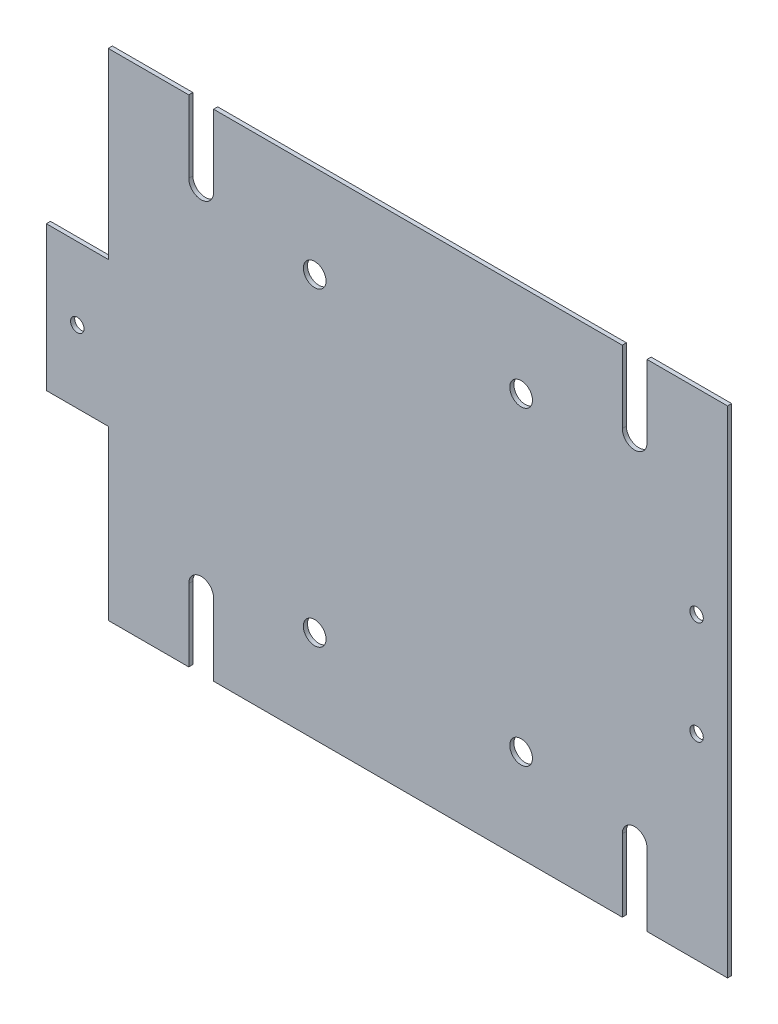
ISO-10303-21;
HEADER;
FILE_DESCRIPTION(('STEP AP214'),'2;1');
FILE_NAME('part.step','',(''),(''),'','','');
FILE_SCHEMA(('AUTOMOTIVE_DESIGN { 1 0 10303 214 1 1 1 1 }'));
ENDSEC;
DATA;
#1=APPLICATION_CONTEXT('core data for automotive mechanical design processes');
#2=APPLICATION_PROTOCOL_DEFINITION('international standard','automotive_design',2000,#1);
#3=PRODUCT_CONTEXT('',#1,'mechanical');
#4=PRODUCT('Part','Part','',(#3));
#5=PRODUCT_RELATED_PRODUCT_CATEGORY('part','',(#4));
#6=PRODUCT_DEFINITION_FORMATION('','',#4);
#7=PRODUCT_DEFINITION_CONTEXT('part definition',#1,'design');
#8=PRODUCT_DEFINITION('design','',#6,#7);
#9=PRODUCT_DEFINITION_SHAPE('','',#8);
#10=(LENGTH_UNIT() NAMED_UNIT(*) SI_UNIT(.MILLI.,.METRE.));
#11=(NAMED_UNIT(*) PLANE_ANGLE_UNIT() SI_UNIT($,.RADIAN.));
#12=(NAMED_UNIT(*) SI_UNIT($,.STERADIAN.) SOLID_ANGLE_UNIT());
#13=UNCERTAINTY_MEASURE_WITH_UNIT(LENGTH_MEASURE(1.E-05),#10,'distance_accuracy_value','');
#14=(GEOMETRIC_REPRESENTATION_CONTEXT(3) GLOBAL_UNCERTAINTY_ASSIGNED_CONTEXT((#13)) GLOBAL_UNIT_ASSIGNED_CONTEXT((#10,
#11,#12)) REPRESENTATION_CONTEXT('',''));
#15=CARTESIAN_POINT('',(0.,0.,0.));
#16=DIRECTION('',(0.,0.,1.));
#17=DIRECTION('',(1.,0.,0.));
#18=AXIS2_PLACEMENT_3D('',#15,#16,#17);
#19=CARTESIAN_POINT('',(23.9488218182788,-146.633764285917,2.));
#20=DIRECTION('',(0.,0.,1.));
#21=DIRECTION('',(1.,0.,0.));
#22=AXIS2_PLACEMENT_3D('',#19,#20,#21);
#23=PLANE('',#22);
#24=CARTESIAN_POINT('',(-131.051178181721,-136.753764285917,2.));
#25=DIRECTION('',(0.,0.,1.));
#26=DIRECTION('',(1.,0.,0.));
#27=AXIS2_PLACEMENT_3D('',#24,#25,#26);
#28=CIRCLE('',#27,5.50000000000002);
#29=CARTESIAN_POINT('',(-125.551178181721,-136.753764285917,2.));
#30=VERTEX_POINT('',#29);
#31=EDGE_CURVE('E434',#30,#30,#28,.T.);
#32=ORIENTED_EDGE('',*,*,#31,.F.);
#33=EDGE_LOOP('',(#32));
#34=FACE_BOUND('',#33,.T.);
#35=CARTESIAN_POINT('',(-246.051178181721,-65.1798561151079,2.));
#36=DIRECTION('',(0.,0.,1.));
#37=DIRECTION('',(1.,0.,0.));
#38=AXIS2_PLACEMENT_3D('',#35,#36,#37);
#39=CIRCLE('',#38,3.25000000000001);
#40=CARTESIAN_POINT('',(-242.801178181721,-65.1798561151079,2.));
#41=VERTEX_POINT('',#40);
#42=EDGE_CURVE('E422',#41,#41,#39,.T.);
#43=ORIENTED_EDGE('',*,*,#42,.F.);
#44=EDGE_LOOP('',(#43));
#45=FACE_BOUND('',#44,.T.);
#46=CARTESIAN_POINT('',(-131.051178181721,13.4862357140828,2.));
#47=DIRECTION('',(0.,0.,1.));
#48=DIRECTION('',(1.,0.,0.));
#49=AXIS2_PLACEMENT_3D('',#46,#47,#48);
#50=CIRCLE('',#49,5.50000000000002);
#51=CARTESIAN_POINT('',(-125.551178181721,13.4862357140828,2.));
#52=VERTEX_POINT('',#51);
#53=EDGE_CURVE('E410',#52,#52,#50,.T.);
#54=ORIENTED_EDGE('',*,*,#53,.F.);
#55=EDGE_LOOP('',(#54));
#56=FACE_BOUND('',#55,.T.);
#57=DIRECTION('',(0.,1.,0.));
#58=VECTOR('',#57,1.);
#59=CARTESIAN_POINT('',(68.9488218182787,58.3662357140828,2.));
#60=LINE('',#59,#58);
#61=CARTESIAN_POINT('',(68.9488218182788,-181.633764285917,2.));
#62=VERTEX_POINT('',#61);
#63=CARTESIAN_POINT('',(68.9488218182787,58.3662357140828,2.));
#64=VERTEX_POINT('',#63);
#65=EDGE_CURVE('E51',#62,#64,#60,.T.);
#66=ORIENTED_EDGE('',*,*,#65,.T.);
#67=DIRECTION('',(-1.,0.,0.));
#68=VECTOR('',#67,1.);
#69=CARTESIAN_POINT('',(68.9488218182787,58.3662357140828,2.));
#70=LINE('',#69,#68);
#71=CARTESIAN_POINT('',(29.9488218182788,58.3662357140828,2.));
#72=VERTEX_POINT('',#71);
#73=EDGE_CURVE('E143',#64,#72,#70,.T.);
#74=ORIENTED_EDGE('',*,*,#73,.T.);
#75=DIRECTION('',(0.,-1.,0.));
#76=VECTOR('',#75,1.);
#77=CARTESIAN_POINT('',(29.9488218182788,58.3662357140828,2.));
#78=LINE('',#77,#76);
#79=CARTESIAN_POINT('',(29.9488218182787,23.3662357140828,2.));
#80=VERTEX_POINT('',#79);
#81=EDGE_CURVE('E339',#72,#80,#78,.T.);
#82=ORIENTED_EDGE('',*,*,#81,.T.);
#83=CARTESIAN_POINT('',(23.9488218182787,23.3662357140828,2.));
#84=DIRECTION('',(0.,0.,-1.));
#85=DIRECTION('',(1.,0.,0.));
#86=AXIS2_PLACEMENT_3D('',#83,#84,#85);
#87=CIRCLE('',#86,6.);
#88=CARTESIAN_POINT('',(17.9488218182787,23.3662357140828,2.));
#89=VERTEX_POINT('',#88);
#90=EDGE_CURVE('E359',#80,#89,#87,.T.);
#91=ORIENTED_EDGE('',*,*,#90,.T.);
#92=DIRECTION('',(0.,1.,0.));
#93=VECTOR('',#92,1.);
#94=CARTESIAN_POINT('',(17.9488218182788,58.3662357140828,2.));
#95=LINE('',#94,#93);
#96=CARTESIAN_POINT('',(17.9488218182788,58.3662357140828,2.));
#97=VERTEX_POINT('',#96);
#98=EDGE_CURVE('E356',#89,#97,#95,.T.);
#99=ORIENTED_EDGE('',*,*,#98,.T.);
#100=DIRECTION('',(-1.,0.,0.));
#101=VECTOR('',#100,1.);
#102=CARTESIAN_POINT('',(17.9488218182788,58.3662357140828,2.));
#103=LINE('',#102,#101);
#104=CARTESIAN_POINT('',(-180.051178181721,58.3662357140828,2.));
#105=VERTEX_POINT('',#104);
#106=EDGE_CURVE('E358',#97,#105,#103,.T.);
#107=ORIENTED_EDGE('',*,*,#106,.T.);
#108=DIRECTION('',(0.,-1.,0.));
#109=VECTOR('',#108,1.);
#110=CARTESIAN_POINT('',(-180.051178181721,58.3662357140828,2.));
#111=LINE('',#110,#109);
#112=CARTESIAN_POINT('',(-180.051178181721,23.3662357140828,2.));
#113=VERTEX_POINT('',#112);
#114=EDGE_CURVE('E361',#105,#113,#111,.T.);
#115=ORIENTED_EDGE('',*,*,#114,.T.);
#116=CARTESIAN_POINT('',(-186.051178181721,23.3662357140828,2.));
#117=DIRECTION('',(0.,0.,-1.));
#118=DIRECTION('',(1.,0.,0.));
#119=AXIS2_PLACEMENT_3D('',#116,#117,#118);
#120=CIRCLE('',#119,5.99999999999996);
#121=CARTESIAN_POINT('',(-192.051178181721,23.3662357140828,2.));
#122=VERTEX_POINT('',#121);
#123=EDGE_CURVE('E367',#113,#122,#120,.T.);
#124=ORIENTED_EDGE('',*,*,#123,.T.);
#125=DIRECTION('',(0.,1.,0.));
#126=VECTOR('',#125,1.);
#127=CARTESIAN_POINT('',(-192.051178181721,58.3662357140828,2.));
#128=LINE('',#127,#126);
#129=CARTESIAN_POINT('',(-192.051178181721,58.3662357140828,2.));
#130=VERTEX_POINT('',#129);
#131=EDGE_CURVE('E369',#122,#130,#128,.T.);
#132=ORIENTED_EDGE('',*,*,#131,.T.);
#133=DIRECTION('',(-1.,0.,0.));
#134=VECTOR('',#133,1.);
#135=CARTESIAN_POINT('',(-192.051178181721,58.3662357140828,2.));
#136=LINE('',#135,#134);
#137=CARTESIAN_POINT('',(-231.051178181721,58.3662357140828,2.));
#138=VERTEX_POINT('',#137);
#139=EDGE_CURVE('E371',#130,#138,#136,.T.);
#140=ORIENTED_EDGE('',*,*,#139,.T.);
#141=DIRECTION('',(0.,-1.,0.));
#142=VECTOR('',#141,1.);
#143=CARTESIAN_POINT('',(-231.051178181721,58.3662357140828,2.));
#144=LINE('',#143,#142);
#145=CARTESIAN_POINT('',(-231.051178181721,-30.1798561151079,2.));
#146=VERTEX_POINT('',#145);
#147=EDGE_CURVE('E373',#138,#146,#144,.T.);
#148=ORIENTED_EDGE('',*,*,#147,.T.);
#149=DIRECTION('',(-1.,0.,0.));
#150=VECTOR('',#149,1.);
#151=CARTESIAN_POINT('',(-231.051178181721,-30.1798561151079,2.));
#152=LINE('',#151,#150);
#153=CARTESIAN_POINT('',(-261.051178181721,-30.1798561151079,2.));
#154=VERTEX_POINT('',#153);
#155=EDGE_CURVE('E375',#146,#154,#152,.T.);
#156=ORIENTED_EDGE('',*,*,#155,.T.);
#157=DIRECTION('',(0.,-1.,0.));
#158=VECTOR('',#157,1.);
#159=CARTESIAN_POINT('',(-261.051178181721,-30.1798561151079,2.));
#160=LINE('',#159,#158);
#161=CARTESIAN_POINT('',(-261.051178181721,-100.179856115108,2.));
#162=VERTEX_POINT('',#161);
#163=EDGE_CURVE('E377',#154,#162,#160,.T.);
#164=ORIENTED_EDGE('',*,*,#163,.T.);
#165=DIRECTION('',(1.,0.,0.));
#166=VECTOR('',#165,1.);
#167=CARTESIAN_POINT('',(-261.051178181721,-100.179856115108,2.));
#168=LINE('',#167,#166);
#169=CARTESIAN_POINT('',(-231.051178181721,-100.179856115108,2.));
#170=VERTEX_POINT('',#169);
#171=EDGE_CURVE('E379',#162,#170,#168,.T.);
#172=ORIENTED_EDGE('',*,*,#171,.T.);
#173=DIRECTION('',(0.,-1.,0.));
#174=VECTOR('',#173,1.);
#175=CARTESIAN_POINT('',(-231.051178181721,-100.179856115108,2.));
#176=LINE('',#175,#174);
#177=CARTESIAN_POINT('',(-231.051178181721,-181.633764285917,2.));
#178=VERTEX_POINT('',#177);
#179=EDGE_CURVE('E381',#170,#178,#176,.T.);
#180=ORIENTED_EDGE('',*,*,#179,.T.);
#181=DIRECTION('',(1.,0.,0.));
#182=VECTOR('',#181,1.);
#183=CARTESIAN_POINT('',(-192.051178181721,-181.633764285917,2.));
#184=LINE('',#183,#182);
#185=CARTESIAN_POINT('',(-192.051178181721,-181.633764285917,2.));
#186=VERTEX_POINT('',#185);
#187=EDGE_CURVE('E383',#178,#186,#184,.T.);
#188=ORIENTED_EDGE('',*,*,#187,.T.);
#189=DIRECTION('',(0.,1.,0.));
#190=VECTOR('',#189,1.);
#191=CARTESIAN_POINT('',(-192.051178181721,-181.633764285917,2.));
#192=LINE('',#191,#190);
#193=CARTESIAN_POINT('',(-192.051178181721,-146.633764285917,2.));
#194=VERTEX_POINT('',#193);
#195=EDGE_CURVE('E385',#186,#194,#192,.T.);
#196=ORIENTED_EDGE('',*,*,#195,.T.);
#197=CARTESIAN_POINT('',(-186.051178181721,-146.633764285917,2.));
#198=DIRECTION('',(0.,0.,-1.));
#199=DIRECTION('',(1.,0.,0.));
#200=AXIS2_PLACEMENT_3D('',#197,#198,#199);
#201=CIRCLE('',#200,6.00000000000001);
#202=CARTESIAN_POINT('',(-180.051178181721,-146.633764285917,2.));
#203=VERTEX_POINT('',#202);
#204=EDGE_CURVE('E387',#194,#203,#201,.T.);
#205=ORIENTED_EDGE('',*,*,#204,.T.);
#206=DIRECTION('',(0.,-1.,0.));
#207=VECTOR('',#206,1.);
#208=CARTESIAN_POINT('',(-180.051178181721,-181.633764285917,2.));
#209=LINE('',#208,#207);
#210=CARTESIAN_POINT('',(-180.051178181721,-181.633764285917,2.));
#211=VERTEX_POINT('',#210);
#212=EDGE_CURVE('E389',#203,#211,#209,.T.);
#213=ORIENTED_EDGE('',*,*,#212,.T.);
#214=DIRECTION('',(1.,0.,0.));
#215=VECTOR('',#214,1.);
#216=CARTESIAN_POINT('',(17.9488218182788,-181.633764285917,2.));
#217=LINE('',#216,#215);
#218=CARTESIAN_POINT('',(17.9488218182788,-181.633764285917,2.));
#219=VERTEX_POINT('',#218);
#220=EDGE_CURVE('E391',#211,#219,#217,.T.);
#221=ORIENTED_EDGE('',*,*,#220,.T.);
#222=DIRECTION('',(0.,1.,0.));
#223=VECTOR('',#222,1.);
#224=CARTESIAN_POINT('',(17.9488218182788,-146.633764285917,2.));
#225=LINE('',#224,#223);
#226=CARTESIAN_POINT('',(17.9488218182788,-146.633764285917,2.));
#227=VERTEX_POINT('',#226);
#228=EDGE_CURVE('E211',#219,#227,#225,.T.);
#229=ORIENTED_EDGE('',*,*,#228,.T.);
#230=CARTESIAN_POINT('',(23.9488218182788,-146.633764285917,2.));
#231=DIRECTION('',(0.,0.,-1.));
#232=DIRECTION('',(1.,0.,0.));
#233=AXIS2_PLACEMENT_3D('',#230,#231,#232);
#234=CIRCLE('',#233,6.00000000000001);
#235=CARTESIAN_POINT('',(29.9488218182788,-146.633764285917,2.));
#236=VERTEX_POINT('',#235);
#237=EDGE_CURVE('E205',#227,#236,#234,.T.);
#238=ORIENTED_EDGE('',*,*,#237,.T.);
#239=DIRECTION('',(0.,-1.,0.));
#240=VECTOR('',#239,1.);
#241=CARTESIAN_POINT('',(29.9488218182788,-146.633764285917,2.));
#242=LINE('',#241,#240);
#243=CARTESIAN_POINT('',(29.9488218182788,-181.633764285917,2.));
#244=VERTEX_POINT('',#243);
#245=EDGE_CURVE('E209',#236,#244,#242,.T.);
#246=ORIENTED_EDGE('',*,*,#245,.T.);
#247=DIRECTION('',(1.,0.,0.));
#248=VECTOR('',#247,1.);
#249=CARTESIAN_POINT('',(68.9488218182788,-181.633764285917,2.));
#250=LINE('',#249,#248);
#251=EDGE_CURVE('E225',#244,#62,#250,.T.);
#252=ORIENTED_EDGE('',*,*,#251,.T.);
#253=EDGE_LOOP('',(#66,#74,#82,#91,#99,#107,#115,#124,#132,#140,#148,#156,#164,#172,#180,#188,
#196,#205,#213,#221,#229,#238,#246,#252));
#254=FACE_BOUND('',#253,.T.);
#255=CARTESIAN_POINT('',(53.9488218182788,-36.6337642859172,2.));
#256=DIRECTION('',(0.,0.,1.));
#257=DIRECTION('',(1.,0.,0.));
#258=AXIS2_PLACEMENT_3D('',#255,#256,#257);
#259=CIRCLE('',#258,3.25);
#260=CARTESIAN_POINT('',(57.1988218182788,-36.6337642859172,2.));
#261=VERTEX_POINT('',#260);
#262=EDGE_CURVE('E234',#261,#261,#259,.T.);
#263=ORIENTED_EDGE('',*,*,#262,.F.);
#264=EDGE_LOOP('',(#263));
#265=FACE_BOUND('',#264,.T.);
#266=CARTESIAN_POINT('',(53.9488218182788,-86.6337642859172,2.));
#267=DIRECTION('',(0.,0.,1.));
#268=DIRECTION('',(1.,0.,0.));
#269=AXIS2_PLACEMENT_3D('',#266,#267,#268);
#270=CIRCLE('',#269,3.25);
#271=CARTESIAN_POINT('',(57.1988218182788,-86.6337642859172,2.));
#272=VERTEX_POINT('',#271);
#273=EDGE_CURVE('E416',#272,#272,#270,.T.);
#274=ORIENTED_EDGE('',*,*,#273,.F.);
#275=EDGE_LOOP('',(#274));
#276=FACE_BOUND('',#275,.T.);
#277=CARTESIAN_POINT('',(-31.0511781817212,-136.753764285917,2.));
#278=DIRECTION('',(0.,0.,1.));
#279=DIRECTION('',(1.,0.,0.));
#280=AXIS2_PLACEMENT_3D('',#277,#278,#279);
#281=CIRCLE('',#280,5.5);
#282=CARTESIAN_POINT('',(-25.5511781817212,-136.753764285917,2.));
#283=VERTEX_POINT('',#282);
#284=EDGE_CURVE('E428',#283,#283,#281,.T.);
#285=ORIENTED_EDGE('',*,*,#284,.F.);
#286=EDGE_LOOP('',(#285));
#287=FACE_BOUND('',#286,.T.);
#288=CARTESIAN_POINT('',(-31.0511781817212,13.4862357140828,2.));
#289=DIRECTION('',(0.,0.,1.));
#290=DIRECTION('',(1.,0.,0.));
#291=AXIS2_PLACEMENT_3D('',#288,#289,#290);
#292=CIRCLE('',#291,5.5);
#293=CARTESIAN_POINT('',(-25.5511781817213,13.4862357140828,2.));
#294=VERTEX_POINT('',#293);
#295=EDGE_CURVE('E440',#294,#294,#292,.T.);
#296=ORIENTED_EDGE('',*,*,#295,.F.);
#297=EDGE_LOOP('',(#296));
#298=FACE_BOUND('',#297,.T.);
#299=ADVANCED_FACE('F34',(#34,#45,#56,#254,#265,#276,#287,#298),#23,.T.);
#300=CARTESIAN_POINT('',(23.9488218182788,-146.633764285917,0.));
#301=DIRECTION('',(0.,0.,1.));
#302=DIRECTION('',(1.,0.,0.));
#303=AXIS2_PLACEMENT_3D('',#300,#301,#302);
#304=PLANE('',#303);
#305=DIRECTION('',(-1.,0.,0.));
#306=VECTOR('',#305,1.);
#307=CARTESIAN_POINT('',(68.9488218182787,58.3662357140828,0.));
#308=LINE('',#307,#306);
#309=CARTESIAN_POINT('',(68.9488218182787,58.3662357140828,0.));
#310=VERTEX_POINT('',#309);
#311=CARTESIAN_POINT('',(29.9488218182788,58.3662357140828,0.));
#312=VERTEX_POINT('',#311);
#313=EDGE_CURVE('E231',#310,#312,#308,.T.);
#314=ORIENTED_EDGE('',*,*,#313,.F.);
#315=DIRECTION('',(0.,1.,0.));
#316=VECTOR('',#315,1.);
#317=CARTESIAN_POINT('',(68.9488218182788,-26.6337642859172,0.));
#318=LINE('',#317,#316);
#319=CARTESIAN_POINT('',(68.9488218182788,-181.633764285917,0.));
#320=VERTEX_POINT('',#319);
#321=EDGE_CURVE('E275',#320,#310,#318,.T.);
#322=ORIENTED_EDGE('',*,*,#321,.F.);
#323=DIRECTION('',(1.,0.,0.));
#324=VECTOR('',#323,1.);
#325=CARTESIAN_POINT('',(68.9488218182788,-181.633764285917,0.));
#326=LINE('',#325,#324);
#327=CARTESIAN_POINT('',(29.9488218182788,-181.633764285917,0.));
#328=VERTEX_POINT('',#327);
#329=EDGE_CURVE('E136',#328,#320,#326,.T.);
#330=ORIENTED_EDGE('',*,*,#329,.F.);
#331=DIRECTION('',(0.,-1.,0.));
#332=VECTOR('',#331,1.);
#333=CARTESIAN_POINT('',(29.9488218182788,-146.633764285917,0.));
#334=LINE('',#333,#332);
#335=CARTESIAN_POINT('',(29.9488218182788,-146.633764285917,0.));
#336=VERTEX_POINT('',#335);
#337=EDGE_CURVE('E129',#336,#328,#334,.T.);
#338=ORIENTED_EDGE('',*,*,#337,.F.);
#339=CARTESIAN_POINT('',(23.9488218182788,-146.633764285917,0.));
#340=DIRECTION('',(0.,0.,-1.));
#341=DIRECTION('',(1.,0.,0.));
#342=AXIS2_PLACEMENT_3D('',#339,#340,#341);
#343=CIRCLE('',#342,6.00000000000001);
#344=CARTESIAN_POINT('',(17.9488218182788,-146.633764285917,0.));
#345=VERTEX_POINT('',#344);
#346=EDGE_CURVE('E219',#345,#336,#343,.T.);
#347=ORIENTED_EDGE('',*,*,#346,.F.);
#348=DIRECTION('',(0.,1.,0.));
#349=VECTOR('',#348,1.);
#350=CARTESIAN_POINT('',(17.9488218182788,-146.633764285917,0.));
#351=LINE('',#350,#349);
#352=CARTESIAN_POINT('',(17.9488218182788,-181.633764285917,0.));
#353=VERTEX_POINT('',#352);
#354=EDGE_CURVE('E270',#353,#345,#351,.T.);
#355=ORIENTED_EDGE('',*,*,#354,.F.);
#356=DIRECTION('',(1.,0.,0.));
#357=VECTOR('',#356,1.);
#358=CARTESIAN_POINT('',(17.9488218182788,-181.633764285917,0.));
#359=LINE('',#358,#357);
#360=CARTESIAN_POINT('',(-180.051178181721,-181.633764285917,0.));
#361=VERTEX_POINT('',#360);
#362=EDGE_CURVE('E268',#361,#353,#359,.T.);
#363=ORIENTED_EDGE('',*,*,#362,.F.);
#364=DIRECTION('',(0.,-1.,0.));
#365=VECTOR('',#364,1.);
#366=CARTESIAN_POINT('',(-180.051178181721,-181.633764285917,0.));
#367=LINE('',#366,#365);
#368=CARTESIAN_POINT('',(-180.051178181721,-146.633764285917,0.));
#369=VERTEX_POINT('',#368);
#370=EDGE_CURVE('E266',#369,#361,#367,.T.);
#371=ORIENTED_EDGE('',*,*,#370,.F.);
#372=CARTESIAN_POINT('',(-186.051178181721,-146.633764285917,0.));
#373=DIRECTION('',(0.,0.,-1.));
#374=DIRECTION('',(1.,0.,0.));
#375=AXIS2_PLACEMENT_3D('',#372,#373,#374);
#376=CIRCLE('',#375,6.00000000000001);
#377=CARTESIAN_POINT('',(-192.051178181721,-146.633764285917,0.));
#378=VERTEX_POINT('',#377);
#379=EDGE_CURVE('E264',#378,#369,#376,.T.);
#380=ORIENTED_EDGE('',*,*,#379,.F.);
#381=DIRECTION('',(0.,1.,0.));
#382=VECTOR('',#381,1.);
#383=CARTESIAN_POINT('',(-192.051178181721,-181.633764285917,0.));
#384=LINE('',#383,#382);
#385=CARTESIAN_POINT('',(-192.051178181721,-181.633764285917,0.));
#386=VERTEX_POINT('',#385);
#387=EDGE_CURVE('E262',#386,#378,#384,.T.);
#388=ORIENTED_EDGE('',*,*,#387,.F.);
#389=DIRECTION('',(1.,0.,0.));
#390=VECTOR('',#389,1.);
#391=CARTESIAN_POINT('',(-192.051178181721,-181.633764285917,0.));
#392=LINE('',#391,#390);
#393=CARTESIAN_POINT('',(-231.051178181721,-181.633764285917,0.));
#394=VERTEX_POINT('',#393);
#395=EDGE_CURVE('E260',#394,#386,#392,.T.);
#396=ORIENTED_EDGE('',*,*,#395,.F.);
#397=DIRECTION('',(0.,-1.,0.));
#398=VECTOR('',#397,1.);
#399=CARTESIAN_POINT('',(-231.051178181721,-100.179856115108,0.));
#400=LINE('',#399,#398);
#401=CARTESIAN_POINT('',(-231.051178181721,-100.179856115108,0.));
#402=VERTEX_POINT('',#401);
#403=EDGE_CURVE('E258',#402,#394,#400,.T.);
#404=ORIENTED_EDGE('',*,*,#403,.F.);
#405=DIRECTION('',(1.,0.,0.));
#406=VECTOR('',#405,1.);
#407=CARTESIAN_POINT('',(-261.051178181721,-100.179856115108,0.));
#408=LINE('',#407,#406);
#409=CARTESIAN_POINT('',(-261.051178181721,-100.179856115108,0.));
#410=VERTEX_POINT('',#409);
#411=EDGE_CURVE('E256',#410,#402,#408,.T.);
#412=ORIENTED_EDGE('',*,*,#411,.F.);
#413=DIRECTION('',(0.,-1.,0.));
#414=VECTOR('',#413,1.);
#415=CARTESIAN_POINT('',(-261.051178181721,-30.1798561151079,0.));
#416=LINE('',#415,#414);
#417=CARTESIAN_POINT('',(-261.051178181721,-30.1798561151079,0.));
#418=VERTEX_POINT('',#417);
#419=EDGE_CURVE('E254',#418,#410,#416,.T.);
#420=ORIENTED_EDGE('',*,*,#419,.F.);
#421=DIRECTION('',(-1.,0.,0.));
#422=VECTOR('',#421,1.);
#423=CARTESIAN_POINT('',(-231.051178181721,-30.1798561151079,0.));
#424=LINE('',#423,#422);
#425=CARTESIAN_POINT('',(-231.051178181721,-30.1798561151079,0.));
#426=VERTEX_POINT('',#425);
#427=EDGE_CURVE('E252',#426,#418,#424,.T.);
#428=ORIENTED_EDGE('',*,*,#427,.F.);
#429=DIRECTION('',(0.,-1.,0.));
#430=VECTOR('',#429,1.);
#431=CARTESIAN_POINT('',(-231.051178181721,58.3662357140828,0.));
#432=LINE('',#431,#430);
#433=CARTESIAN_POINT('',(-231.051178181721,58.3662357140828,0.));
#434=VERTEX_POINT('',#433);
#435=EDGE_CURVE('E250',#434,#426,#432,.T.);
#436=ORIENTED_EDGE('',*,*,#435,.F.);
#437=DIRECTION('',(-1.,0.,0.));
#438=VECTOR('',#437,1.);
#439=CARTESIAN_POINT('',(-192.051178181721,58.3662357140828,0.));
#440=LINE('',#439,#438);
#441=CARTESIAN_POINT('',(-192.051178181721,58.3662357140828,0.));
#442=VERTEX_POINT('',#441);
#443=EDGE_CURVE('E248',#442,#434,#440,.T.);
#444=ORIENTED_EDGE('',*,*,#443,.F.);
#445=DIRECTION('',(0.,1.,0.));
#446=VECTOR('',#445,1.);
#447=CARTESIAN_POINT('',(-192.051178181721,58.3662357140828,0.));
#448=LINE('',#447,#446);
#449=CARTESIAN_POINT('',(-192.051178181721,23.3662357140828,0.));
#450=VERTEX_POINT('',#449);
#451=EDGE_CURVE('E246',#450,#442,#448,.T.);
#452=ORIENTED_EDGE('',*,*,#451,.F.);
#453=CARTESIAN_POINT('',(-186.051178181721,23.3662357140828,0.));
#454=DIRECTION('',(0.,0.,-1.));
#455=DIRECTION('',(1.,0.,0.));
#456=AXIS2_PLACEMENT_3D('',#453,#454,#455);
#457=CIRCLE('',#456,5.99999999999996);
#458=CARTESIAN_POINT('',(-180.051178181721,23.3662357140828,0.));
#459=VERTEX_POINT('',#458);
#460=EDGE_CURVE('E244',#459,#450,#457,.T.);
#461=ORIENTED_EDGE('',*,*,#460,.F.);
#462=DIRECTION('',(0.,-1.,0.));
#463=VECTOR('',#462,1.);
#464=CARTESIAN_POINT('',(-180.051178181721,58.3662357140828,0.));
#465=LINE('',#464,#463);
#466=CARTESIAN_POINT('',(-180.051178181721,58.3662357140828,0.));
#467=VERTEX_POINT('',#466);
#468=EDGE_CURVE('E242',#467,#459,#465,.T.);
#469=ORIENTED_EDGE('',*,*,#468,.F.);
#470=DIRECTION('',(-1.,0.,0.));
#471=VECTOR('',#470,1.);
#472=CARTESIAN_POINT('',(17.9488218182788,58.3662357140828,0.));
#473=LINE('',#472,#471);
#474=CARTESIAN_POINT('',(17.9488218182788,58.3662357140828,0.));
#475=VERTEX_POINT('',#474);
#476=EDGE_CURVE('E240',#475,#467,#473,.T.);
#477=ORIENTED_EDGE('',*,*,#476,.F.);
#478=DIRECTION('',(0.,1.,0.));
#479=VECTOR('',#478,1.);
#480=CARTESIAN_POINT('',(17.9488218182788,58.3662357140828,0.));
#481=LINE('',#480,#479);
#482=CARTESIAN_POINT('',(17.9488218182787,23.3662357140828,0.));
#483=VERTEX_POINT('',#482);
#484=EDGE_CURVE('E238',#483,#475,#481,.T.);
#485=ORIENTED_EDGE('',*,*,#484,.F.);
#486=CARTESIAN_POINT('',(23.9488218182787,23.3662357140828,0.));
#487=DIRECTION('',(0.,0.,-1.));
#488=DIRECTION('',(1.,0.,0.));
#489=AXIS2_PLACEMENT_3D('',#486,#487,#488);
#490=CIRCLE('',#489,6.);
#491=CARTESIAN_POINT('',(29.9488218182787,23.3662357140828,0.));
#492=VERTEX_POINT('',#491);
#493=EDGE_CURVE('E236',#492,#483,#490,.T.);
#494=ORIENTED_EDGE('',*,*,#493,.F.);
#495=DIRECTION('',(0.,-1.,0.));
#496=VECTOR('',#495,1.);
#497=CARTESIAN_POINT('',(29.9488218182788,58.3662357140828,0.));
#498=LINE('',#497,#496);
#499=EDGE_CURVE('E233',#312,#492,#498,.T.);
#500=ORIENTED_EDGE('',*,*,#499,.F.);
#501=EDGE_LOOP('',(#314,#322,#330,#338,#347,#355,#363,#371,#380,#388,#396,#404,#412,#420,#428,
#436,#444,#452,#461,#469,#477,#485,#494,#500));
#502=FACE_BOUND('',#501,.T.);
#503=CARTESIAN_POINT('',(53.9488218182788,-36.6337642859172,0.));
#504=DIRECTION('',(0.,0.,1.));
#505=DIRECTION('',(1.,0.,0.));
#506=AXIS2_PLACEMENT_3D('',#503,#504,#505);
#507=CIRCLE('',#506,3.25);
#508=CARTESIAN_POINT('',(57.1988218182788,-36.6337642859172,0.));
#509=VERTEX_POINT('',#508);
#510=EDGE_CURVE('E407',#509,#509,#507,.T.);
#511=ORIENTED_EDGE('',*,*,#510,.T.);
#512=EDGE_LOOP('',(#511));
#513=FACE_BOUND('',#512,.T.);
#514=CARTESIAN_POINT('',(-131.051178181721,13.4862357140828,0.));
#515=DIRECTION('',(0.,0.,1.));
#516=DIRECTION('',(1.,0.,0.));
#517=AXIS2_PLACEMENT_3D('',#514,#515,#516);
#518=CIRCLE('',#517,5.50000000000002);
#519=CARTESIAN_POINT('',(-125.551178181721,13.4862357140828,0.));
#520=VERTEX_POINT('',#519);
#521=EDGE_CURVE('E413',#520,#520,#518,.T.);
#522=ORIENTED_EDGE('',*,*,#521,.T.);
#523=EDGE_LOOP('',(#522));
#524=FACE_BOUND('',#523,.T.);
#525=CARTESIAN_POINT('',(53.9488218182788,-86.6337642859172,0.));
#526=DIRECTION('',(0.,0.,1.));
#527=DIRECTION('',(1.,0.,0.));
#528=AXIS2_PLACEMENT_3D('',#525,#526,#527);
#529=CIRCLE('',#528,3.25);
#530=CARTESIAN_POINT('',(57.1988218182788,-86.6337642859172,0.));
#531=VERTEX_POINT('',#530);
#532=EDGE_CURVE('E419',#531,#531,#529,.T.);
#533=ORIENTED_EDGE('',*,*,#532,.T.);
#534=EDGE_LOOP('',(#533));
#535=FACE_BOUND('',#534,.T.);
#536=CARTESIAN_POINT('',(-246.051178181721,-65.1798561151079,0.));
#537=DIRECTION('',(0.,0.,1.));
#538=DIRECTION('',(1.,0.,0.));
#539=AXIS2_PLACEMENT_3D('',#536,#537,#538);
#540=CIRCLE('',#539,3.25000000000001);
#541=CARTESIAN_POINT('',(-242.801178181721,-65.1798561151079,0.));
#542=VERTEX_POINT('',#541);
#543=EDGE_CURVE('E425',#542,#542,#540,.T.);
#544=ORIENTED_EDGE('',*,*,#543,.T.);
#545=EDGE_LOOP('',(#544));
#546=FACE_BOUND('',#545,.T.);
#547=CARTESIAN_POINT('',(-31.0511781817212,-136.753764285917,0.));
#548=DIRECTION('',(0.,0.,1.));
#549=DIRECTION('',(1.,0.,0.));
#550=AXIS2_PLACEMENT_3D('',#547,#548,#549);
#551=CIRCLE('',#550,5.5);
#552=CARTESIAN_POINT('',(-25.5511781817212,-136.753764285917,0.));
#553=VERTEX_POINT('',#552);
#554=EDGE_CURVE('E431',#553,#553,#551,.T.);
#555=ORIENTED_EDGE('',*,*,#554,.T.);
#556=EDGE_LOOP('',(#555));
#557=FACE_BOUND('',#556,.T.);
#558=CARTESIAN_POINT('',(-131.051178181721,-136.753764285917,0.));
#559=DIRECTION('',(0.,0.,1.));
#560=DIRECTION('',(1.,0.,0.));
#561=AXIS2_PLACEMENT_3D('',#558,#559,#560);
#562=CIRCLE('',#561,5.50000000000002);
#563=CARTESIAN_POINT('',(-125.551178181721,-136.753764285917,0.));
#564=VERTEX_POINT('',#563);
#565=EDGE_CURVE('E437',#564,#564,#562,.T.);
#566=ORIENTED_EDGE('',*,*,#565,.T.);
#567=EDGE_LOOP('',(#566));
#568=FACE_BOUND('',#567,.T.);
#569=CARTESIAN_POINT('',(-31.0511781817212,13.4862357140828,0.));
#570=DIRECTION('',(0.,0.,1.));
#571=DIRECTION('',(1.,0.,0.));
#572=AXIS2_PLACEMENT_3D('',#569,#570,#571);
#573=CIRCLE('',#572,5.5);
#574=CARTESIAN_POINT('',(-25.5511781817213,13.4862357140828,0.));
#575=VERTEX_POINT('',#574);
#576=EDGE_CURVE('E443',#575,#575,#573,.T.);
#577=ORIENTED_EDGE('',*,*,#576,.T.);
#578=EDGE_LOOP('',(#577));
#579=FACE_BOUND('',#578,.T.);
#580=ADVANCED_FACE('F343',(#502,#513,#524,#535,#546,#557,#568,#579),#304,.F.);
#581=CARTESIAN_POINT('',(68.9488218182787,58.3662357140828,2.));
#582=DIRECTION('',(0.,-1.,0.));
#583=DIRECTION('',(1.,0.,0.));
#584=AXIS2_PLACEMENT_3D('',#581,#582,#583);
#585=PLANE('',#584);
#586=ORIENTED_EDGE('',*,*,#313,.T.);
#587=DIRECTION('',(0.,0.,-1.));
#588=VECTOR('',#587,1.);
#589=CARTESIAN_POINT('',(29.9488218182788,58.3662357140828,2.));
#590=LINE('',#589,#588);
#591=EDGE_CURVE('E43',#72,#312,#590,.T.);
#592=ORIENTED_EDGE('',*,*,#591,.F.);
#593=ORIENTED_EDGE('',*,*,#73,.F.);
#594=DIRECTION('',(0.,0.,-1.));
#595=VECTOR('',#594,1.);
#596=CARTESIAN_POINT('',(68.9488218182787,58.3662357140828,2.));
#597=LINE('',#596,#595);
#598=EDGE_CURVE('E11',#64,#310,#597,.T.);
#599=ORIENTED_EDGE('',*,*,#598,.T.);
#600=EDGE_LOOP('',(#586,#592,#593,#599));
#601=FACE_BOUND('',#600,.T.);
#602=ADVANCED_FACE('F36',(#601),#585,.F.);
#603=CARTESIAN_POINT('',(29.9488218182788,58.3662357140828,2.));
#604=DIRECTION('',(1.,0.,0.));
#605=DIRECTION('',(0.,1.,0.));
#606=AXIS2_PLACEMENT_3D('',#603,#604,#605);
#607=PLANE('',#606);
#608=ORIENTED_EDGE('',*,*,#499,.T.);
#609=DIRECTION('',(0.,0.,-1.));
#610=VECTOR('',#609,1.);
#611=CARTESIAN_POINT('',(29.9488218182787,23.3662357140828,2.));
#612=LINE('',#611,#610);
#613=EDGE_CURVE('E331',#80,#492,#612,.T.);
#614=ORIENTED_EDGE('',*,*,#613,.F.);
#615=ORIENTED_EDGE('',*,*,#81,.F.);
#616=ORIENTED_EDGE('',*,*,#591,.T.);
#617=EDGE_LOOP('',(#608,#614,#615,#616));
#618=FACE_BOUND('',#617,.T.);
#619=ADVANCED_FACE('F337',(#618),#607,.F.);
#620=CARTESIAN_POINT('',(23.9488218182787,23.3662357140828,2.));
#621=DIRECTION('',(0.,0.,-1.));
#622=DIRECTION('',(-1.,0.,0.));
#623=AXIS2_PLACEMENT_3D('',#620,#621,#622);
#624=CYLINDRICAL_SURFACE('',#623,6.);
#625=ORIENTED_EDGE('',*,*,#493,.T.);
#626=DIRECTION('',(0.,0.,-1.));
#627=VECTOR('',#626,1.);
#628=CARTESIAN_POINT('',(17.9488218182787,23.3662357140828,2.));
#629=LINE('',#628,#627);
#630=EDGE_CURVE('E328',#89,#483,#629,.T.);
#631=ORIENTED_EDGE('',*,*,#630,.F.);
#632=ORIENTED_EDGE('',*,*,#90,.F.);
#633=ORIENTED_EDGE('',*,*,#613,.T.);
#634=EDGE_LOOP('',(#625,#631,#632,#633));
#635=FACE_BOUND('',#634,.T.);
#636=ADVANCED_FACE('F350',(#635),#624,.F.);
#637=CARTESIAN_POINT('',(17.9488218182788,58.3662357140828,2.));
#638=DIRECTION('',(-1.,0.,0.));
#639=DIRECTION('',(0.,-1.,0.));
#640=AXIS2_PLACEMENT_3D('',#637,#638,#639);
#641=PLANE('',#640);
#642=ORIENTED_EDGE('',*,*,#484,.T.);
#643=DIRECTION('',(0.,0.,-1.));
#644=VECTOR('',#643,1.);
#645=CARTESIAN_POINT('',(17.9488218182788,58.3662357140828,2.));
#646=LINE('',#645,#644);
#647=EDGE_CURVE('E325',#97,#475,#646,.T.);
#648=ORIENTED_EDGE('',*,*,#647,.F.);
#649=ORIENTED_EDGE('',*,*,#98,.F.);
#650=ORIENTED_EDGE('',*,*,#630,.T.);
#651=EDGE_LOOP('',(#642,#648,#649,#650));
#652=FACE_BOUND('',#651,.T.);
#653=ADVANCED_FACE('F354',(#652),#641,.F.);
#654=CARTESIAN_POINT('',(17.9488218182788,58.3662357140828,2.));
#655=DIRECTION('',(0.,-1.,0.));
#656=DIRECTION('',(1.,0.,0.));
#657=AXIS2_PLACEMENT_3D('',#654,#655,#656);
#658=PLANE('',#657);
#659=ORIENTED_EDGE('',*,*,#476,.T.);
#660=DIRECTION('',(0.,0.,-1.));
#661=VECTOR('',#660,1.);
#662=CARTESIAN_POINT('',(-180.051178181721,58.3662357140828,2.));
#663=LINE('',#662,#661);
#664=EDGE_CURVE('E322',#105,#467,#663,.T.);
#665=ORIENTED_EDGE('',*,*,#664,.F.);
#666=ORIENTED_EDGE('',*,*,#106,.F.);
#667=ORIENTED_EDGE('',*,*,#647,.T.);
#668=EDGE_LOOP('',(#659,#665,#666,#667));
#669=FACE_BOUND('',#668,.T.);
#670=ADVANCED_FACE('F528',(#669),#658,.F.);
#671=CARTESIAN_POINT('',(-180.051178181721,58.3662357140828,2.));
#672=DIRECTION('',(1.,0.,0.));
#673=DIRECTION('',(0.,0.,-1.));
#674=AXIS2_PLACEMENT_3D('',#671,#672,#673);
#675=PLANE('',#674);
#676=ORIENTED_EDGE('',*,*,#468,.T.);
#677=DIRECTION('',(0.,0.,-1.));
#678=VECTOR('',#677,1.);
#679=CARTESIAN_POINT('',(-180.051178181721,23.3662357140828,2.));
#680=LINE('',#679,#678);
#681=EDGE_CURVE('E319',#113,#459,#680,.T.);
#682=ORIENTED_EDGE('',*,*,#681,.F.);
#683=ORIENTED_EDGE('',*,*,#114,.F.);
#684=ORIENTED_EDGE('',*,*,#664,.T.);
#685=EDGE_LOOP('',(#676,#682,#683,#684));
#686=FACE_BOUND('',#685,.T.);
#687=ADVANCED_FACE('F524',(#686),#675,.F.);
#688=CARTESIAN_POINT('',(-186.051178181721,23.3662357140828,2.));
#689=DIRECTION('',(0.,0.,-1.));
#690=DIRECTION('',(-1.,0.,0.));
#691=AXIS2_PLACEMENT_3D('',#688,#689,#690);
#692=CYLINDRICAL_SURFACE('',#691,5.99999999999996);
#693=ORIENTED_EDGE('',*,*,#460,.T.);
#694=DIRECTION('',(0.,0.,-1.));
#695=VECTOR('',#694,1.);
#696=CARTESIAN_POINT('',(-192.051178181721,23.3662357140828,2.));
#697=LINE('',#696,#695);
#698=EDGE_CURVE('E316',#122,#450,#697,.T.);
#699=ORIENTED_EDGE('',*,*,#698,.F.);
#700=ORIENTED_EDGE('',*,*,#123,.F.);
#701=ORIENTED_EDGE('',*,*,#681,.T.);
#702=EDGE_LOOP('',(#693,#699,#700,#701));
#703=FACE_BOUND('',#702,.T.);
#704=ADVANCED_FACE('F520',(#703),#692,.F.);
#705=CARTESIAN_POINT('',(-192.051178181721,58.3662357140828,2.));
#706=DIRECTION('',(-1.,0.,0.));
#707=DIRECTION('',(0.,-1.,0.));
#708=AXIS2_PLACEMENT_3D('',#705,#706,#707);
#709=PLANE('',#708);
#710=ORIENTED_EDGE('',*,*,#451,.T.);
#711=DIRECTION('',(0.,0.,-1.));
#712=VECTOR('',#711,1.);
#713=CARTESIAN_POINT('',(-192.051178181721,58.3662357140828,2.));
#714=LINE('',#713,#712);
#715=EDGE_CURVE('E313',#130,#442,#714,.T.);
#716=ORIENTED_EDGE('',*,*,#715,.F.);
#717=ORIENTED_EDGE('',*,*,#131,.F.);
#718=ORIENTED_EDGE('',*,*,#698,.T.);
#719=EDGE_LOOP('',(#710,#716,#717,#718));
#720=FACE_BOUND('',#719,.T.);
#721=ADVANCED_FACE('F516',(#720),#709,.F.);
#722=CARTESIAN_POINT('',(-192.051178181721,58.3662357140828,2.));
#723=DIRECTION('',(0.,-1.,0.));
#724=DIRECTION('',(0.,0.,-1.));
#725=AXIS2_PLACEMENT_3D('',#722,#723,#724);
#726=PLANE('',#725);
#727=ORIENTED_EDGE('',*,*,#443,.T.);
#728=DIRECTION('',(0.,0.,-1.));
#729=VECTOR('',#728,1.);
#730=CARTESIAN_POINT('',(-231.051178181721,58.3662357140828,2.));
#731=LINE('',#730,#729);
#732=EDGE_CURVE('E310',#138,#434,#731,.T.);
#733=ORIENTED_EDGE('',*,*,#732,.F.);
#734=ORIENTED_EDGE('',*,*,#139,.F.);
#735=ORIENTED_EDGE('',*,*,#715,.T.);
#736=EDGE_LOOP('',(#727,#733,#734,#735));
#737=FACE_BOUND('',#736,.T.);
#738=ADVANCED_FACE('F512',(#737),#726,.F.);
#739=CARTESIAN_POINT('',(-231.051178181721,58.3662357140828,2.));
#740=DIRECTION('',(1.,0.,0.));
#741=DIRECTION('',(0.,1.,0.));
#742=AXIS2_PLACEMENT_3D('',#739,#740,#741);
#743=PLANE('',#742);
#744=ORIENTED_EDGE('',*,*,#435,.T.);
#745=DIRECTION('',(0.,0.,-1.));
#746=VECTOR('',#745,1.);
#747=CARTESIAN_POINT('',(-231.051178181721,-30.1798561151079,2.));
#748=LINE('',#747,#746);
#749=EDGE_CURVE('E307',#146,#426,#748,.T.);
#750=ORIENTED_EDGE('',*,*,#749,.F.);
#751=ORIENTED_EDGE('',*,*,#147,.F.);
#752=ORIENTED_EDGE('',*,*,#732,.T.);
#753=EDGE_LOOP('',(#744,#750,#751,#752));
#754=FACE_BOUND('',#753,.T.);
#755=ADVANCED_FACE('F508',(#754),#743,.F.);
#756=CARTESIAN_POINT('',(-231.051178181721,-30.1798561151079,2.));
#757=DIRECTION('',(0.,-1.,0.));
#758=DIRECTION('',(1.,0.,0.));
#759=AXIS2_PLACEMENT_3D('',#756,#757,#758);
#760=PLANE('',#759);
#761=ORIENTED_EDGE('',*,*,#427,.T.);
#762=DIRECTION('',(0.,0.,-1.));
#763=VECTOR('',#762,1.);
#764=CARTESIAN_POINT('',(-261.051178181721,-30.1798561151079,2.));
#765=LINE('',#764,#763);
#766=EDGE_CURVE('E304',#154,#418,#765,.T.);
#767=ORIENTED_EDGE('',*,*,#766,.F.);
#768=ORIENTED_EDGE('',*,*,#155,.F.);
#769=ORIENTED_EDGE('',*,*,#749,.T.);
#770=EDGE_LOOP('',(#761,#767,#768,#769));
#771=FACE_BOUND('',#770,.T.);
#772=ADVANCED_FACE('F504',(#771),#760,.F.);
#773=CARTESIAN_POINT('',(-261.051178181721,-30.1798561151079,2.));
#774=DIRECTION('',(1.,0.,0.));
#775=DIRECTION('',(0.,0.,-1.));
#776=AXIS2_PLACEMENT_3D('',#773,#774,#775);
#777=PLANE('',#776);
#778=ORIENTED_EDGE('',*,*,#419,.T.);
#779=DIRECTION('',(0.,0.,-1.));
#780=VECTOR('',#779,1.);
#781=CARTESIAN_POINT('',(-261.051178181721,-100.179856115108,2.));
#782=LINE('',#781,#780);
#783=EDGE_CURVE('E301',#162,#410,#782,.T.);
#784=ORIENTED_EDGE('',*,*,#783,.F.);
#785=ORIENTED_EDGE('',*,*,#163,.F.);
#786=ORIENTED_EDGE('',*,*,#766,.T.);
#787=EDGE_LOOP('',(#778,#784,#785,#786));
#788=FACE_BOUND('',#787,.T.);
#789=ADVANCED_FACE('F500',(#788),#777,.F.);
#790=CARTESIAN_POINT('',(-261.051178181721,-100.179856115108,2.));
#791=DIRECTION('',(0.,1.,0.));
#792=DIRECTION('',(0.,0.,1.));
#793=AXIS2_PLACEMENT_3D('',#790,#791,#792);
#794=PLANE('',#793);
#795=ORIENTED_EDGE('',*,*,#411,.T.);
#796=DIRECTION('',(0.,0.,-1.));
#797=VECTOR('',#796,1.);
#798=CARTESIAN_POINT('',(-231.051178181721,-100.179856115108,2.));
#799=LINE('',#798,#797);
#800=EDGE_CURVE('E298',#170,#402,#799,.T.);
#801=ORIENTED_EDGE('',*,*,#800,.F.);
#802=ORIENTED_EDGE('',*,*,#171,.F.);
#803=ORIENTED_EDGE('',*,*,#783,.T.);
#804=EDGE_LOOP('',(#795,#801,#802,#803));
#805=FACE_BOUND('',#804,.T.);
#806=ADVANCED_FACE('F496',(#805),#794,.F.);
#807=CARTESIAN_POINT('',(-231.051178181721,-100.179856115108,2.));
#808=DIRECTION('',(1.,0.,0.));
#809=DIRECTION('',(0.,1.,0.));
#810=AXIS2_PLACEMENT_3D('',#807,#808,#809);
#811=PLANE('',#810);
#812=ORIENTED_EDGE('',*,*,#403,.T.);
#813=DIRECTION('',(0.,0.,-1.));
#814=VECTOR('',#813,1.);
#815=CARTESIAN_POINT('',(-231.051178181721,-181.633764285917,2.));
#816=LINE('',#815,#814);
#817=EDGE_CURVE('E295',#178,#394,#816,.T.);
#818=ORIENTED_EDGE('',*,*,#817,.F.);
#819=ORIENTED_EDGE('',*,*,#179,.F.);
#820=ORIENTED_EDGE('',*,*,#800,.T.);
#821=EDGE_LOOP('',(#812,#818,#819,#820));
#822=FACE_BOUND('',#821,.T.);
#823=ADVANCED_FACE('F492',(#822),#811,.F.);
#824=CARTESIAN_POINT('',(-192.051178181721,-181.633764285917,2.));
#825=DIRECTION('',(0.,1.,0.));
#826=DIRECTION('',(0.,0.,1.));
#827=AXIS2_PLACEMENT_3D('',#824,#825,#826);
#828=PLANE('',#827);
#829=ORIENTED_EDGE('',*,*,#395,.T.);
#830=DIRECTION('',(0.,0.,-1.));
#831=VECTOR('',#830,1.);
#832=CARTESIAN_POINT('',(-192.051178181721,-181.633764285917,2.));
#833=LINE('',#832,#831);
#834=EDGE_CURVE('E292',#186,#386,#833,.T.);
#835=ORIENTED_EDGE('',*,*,#834,.F.);
#836=ORIENTED_EDGE('',*,*,#187,.F.);
#837=ORIENTED_EDGE('',*,*,#817,.T.);
#838=EDGE_LOOP('',(#829,#835,#836,#837));
#839=FACE_BOUND('',#838,.T.);
#840=ADVANCED_FACE('F488',(#839),#828,.F.);
#841=CARTESIAN_POINT('',(-192.051178181721,-181.633764285917,2.));
#842=DIRECTION('',(-1.,0.,0.));
#843=DIRECTION('',(0.,0.,1.));
#844=AXIS2_PLACEMENT_3D('',#841,#842,#843);
#845=PLANE('',#844);
#846=ORIENTED_EDGE('',*,*,#387,.T.);
#847=DIRECTION('',(0.,0.,-1.));
#848=VECTOR('',#847,1.);
#849=CARTESIAN_POINT('',(-192.051178181721,-146.633764285917,2.));
#850=LINE('',#849,#848);
#851=EDGE_CURVE('E289',#194,#378,#850,.T.);
#852=ORIENTED_EDGE('',*,*,#851,.F.);
#853=ORIENTED_EDGE('',*,*,#195,.F.);
#854=ORIENTED_EDGE('',*,*,#834,.T.);
#855=EDGE_LOOP('',(#846,#852,#853,#854));
#856=FACE_BOUND('',#855,.T.);
#857=ADVANCED_FACE('F484',(#856),#845,.F.);
#858=CARTESIAN_POINT('',(-186.051178181721,-146.633764285917,2.));
#859=DIRECTION('',(0.,0.,-1.));
#860=DIRECTION('',(-1.,0.,0.));
#861=AXIS2_PLACEMENT_3D('',#858,#859,#860);
#862=CYLINDRICAL_SURFACE('',#861,6.00000000000001);
#863=ORIENTED_EDGE('',*,*,#379,.T.);
#864=DIRECTION('',(0.,0.,-1.));
#865=VECTOR('',#864,1.);
#866=CARTESIAN_POINT('',(-180.051178181721,-146.633764285917,2.));
#867=LINE('',#866,#865);
#868=EDGE_CURVE('E286',#203,#369,#867,.T.);
#869=ORIENTED_EDGE('',*,*,#868,.F.);
#870=ORIENTED_EDGE('',*,*,#204,.F.);
#871=ORIENTED_EDGE('',*,*,#851,.T.);
#872=EDGE_LOOP('',(#863,#869,#870,#871));
#873=FACE_BOUND('',#872,.T.);
#874=ADVANCED_FACE('F480',(#873),#862,.F.);
#875=CARTESIAN_POINT('',(-180.051178181721,-181.633764285917,2.));
#876=DIRECTION('',(1.,0.,0.));
#877=DIRECTION('',(0.,0.,-1.));
#878=AXIS2_PLACEMENT_3D('',#875,#876,#877);
#879=PLANE('',#878);
#880=ORIENTED_EDGE('',*,*,#370,.T.);
#881=DIRECTION('',(0.,0.,-1.));
#882=VECTOR('',#881,1.);
#883=CARTESIAN_POINT('',(-180.051178181721,-181.633764285917,2.));
#884=LINE('',#883,#882);
#885=EDGE_CURVE('E283',#211,#361,#884,.T.);
#886=ORIENTED_EDGE('',*,*,#885,.F.);
#887=ORIENTED_EDGE('',*,*,#212,.F.);
#888=ORIENTED_EDGE('',*,*,#868,.T.);
#889=EDGE_LOOP('',(#880,#886,#887,#888));
#890=FACE_BOUND('',#889,.T.);
#891=ADVANCED_FACE('F477',(#890),#879,.F.);
#892=CARTESIAN_POINT('',(17.9488218182788,-181.633764285917,2.));
#893=DIRECTION('',(0.,1.,0.));
#894=DIRECTION('',(-1.,0.,0.));
#895=AXIS2_PLACEMENT_3D('',#892,#893,#894);
#896=PLANE('',#895);
#897=ORIENTED_EDGE('',*,*,#362,.T.);
#898=DIRECTION('',(0.,0.,-1.));
#899=VECTOR('',#898,1.);
#900=CARTESIAN_POINT('',(17.9488218182788,-181.633764285917,2.));
#901=LINE('',#900,#899);
#902=EDGE_CURVE('E280',#219,#353,#901,.T.);
#903=ORIENTED_EDGE('',*,*,#902,.F.);
#904=ORIENTED_EDGE('',*,*,#220,.F.);
#905=ORIENTED_EDGE('',*,*,#885,.T.);
#906=EDGE_LOOP('',(#897,#903,#904,#905));
#907=FACE_BOUND('',#906,.T.);
#908=ADVANCED_FACE('F397',(#907),#896,.F.);
#909=CARTESIAN_POINT('',(17.9488218182788,-146.633764285917,2.));
#910=DIRECTION('',(-1.,0.,0.));
#911=DIRECTION('',(0.,-1.,0.));
#912=AXIS2_PLACEMENT_3D('',#909,#910,#911);
#913=PLANE('',#912);
#914=ORIENTED_EDGE('',*,*,#354,.T.);
#915=DIRECTION('',(0.,0.,-1.));
#916=VECTOR('',#915,1.);
#917=CARTESIAN_POINT('',(17.9488218182788,-146.633764285917,2.));
#918=LINE('',#917,#916);
#919=EDGE_CURVE('E220',#227,#345,#918,.T.);
#920=ORIENTED_EDGE('',*,*,#919,.F.);
#921=ORIENTED_EDGE('',*,*,#228,.F.);
#922=ORIENTED_EDGE('',*,*,#902,.T.);
#923=EDGE_LOOP('',(#914,#920,#921,#922));
#924=FACE_BOUND('',#923,.T.);
#925=ADVANCED_FACE('F401',(#924),#913,.F.);
#926=CARTESIAN_POINT('',(23.9488218182788,-146.633764285917,2.));
#927=DIRECTION('',(0.,0.,-1.));
#928=DIRECTION('',(-1.,0.,0.));
#929=AXIS2_PLACEMENT_3D('',#926,#927,#928);
#930=CYLINDRICAL_SURFACE('',#929,6.00000000000001);
#931=ORIENTED_EDGE('',*,*,#346,.T.);
#932=DIRECTION('',(0.,0.,-1.));
#933=VECTOR('',#932,1.);
#934=CARTESIAN_POINT('',(29.9488218182788,-146.633764285917,2.));
#935=LINE('',#934,#933);
#936=EDGE_CURVE('E216',#236,#336,#935,.T.);
#937=ORIENTED_EDGE('',*,*,#936,.F.);
#938=ORIENTED_EDGE('',*,*,#237,.F.);
#939=ORIENTED_EDGE('',*,*,#919,.T.);
#940=EDGE_LOOP('',(#931,#937,#938,#939));
#941=FACE_BOUND('',#940,.T.);
#942=ADVANCED_FACE('F217',(#941),#930,.F.);
#943=CARTESIAN_POINT('',(29.9488218182788,-146.633764285917,2.));
#944=DIRECTION('',(1.,0.,0.));
#945=DIRECTION('',(0.,1.,0.));
#946=AXIS2_PLACEMENT_3D('',#943,#944,#945);
#947=PLANE('',#946);
#948=ORIENTED_EDGE('',*,*,#337,.T.);
#949=DIRECTION('',(0.,0.,-1.));
#950=VECTOR('',#949,1.);
#951=CARTESIAN_POINT('',(29.9488218182788,-181.633764285917,2.));
#952=LINE('',#951,#950);
#953=EDGE_CURVE('E221',#244,#328,#952,.T.);
#954=ORIENTED_EDGE('',*,*,#953,.F.);
#955=ORIENTED_EDGE('',*,*,#245,.F.);
#956=ORIENTED_EDGE('',*,*,#936,.T.);
#957=EDGE_LOOP('',(#948,#954,#955,#956));
#958=FACE_BOUND('',#957,.T.);
#959=ADVANCED_FACE('F223',(#958),#947,.F.);
#960=CARTESIAN_POINT('',(68.9488218182788,-181.633764285917,2.));
#961=DIRECTION('',(0.,1.,0.));
#962=DIRECTION('',(0.,0.,1.));
#963=AXIS2_PLACEMENT_3D('',#960,#961,#962);
#964=PLANE('',#963);
#965=ORIENTED_EDGE('',*,*,#329,.T.);
#966=DIRECTION('',(0.,0.,-1.));
#967=VECTOR('',#966,1.);
#968=CARTESIAN_POINT('',(68.9488218182788,-181.633764285917,2.));
#969=LINE('',#968,#967);
#970=EDGE_CURVE('E227',#62,#320,#969,.T.);
#971=ORIENTED_EDGE('',*,*,#970,.F.);
#972=ORIENTED_EDGE('',*,*,#251,.F.);
#973=ORIENTED_EDGE('',*,*,#953,.T.);
#974=EDGE_LOOP('',(#965,#971,#972,#973));
#975=FACE_BOUND('',#974,.T.);
#976=ADVANCED_FACE('F403',(#975),#964,.F.);
#977=CARTESIAN_POINT('',(68.9488218182788,-26.6337642859172,2.));
#978=DIRECTION('',(-1.,0.,0.));
#979=DIRECTION('',(0.,-1.,0.));
#980=AXIS2_PLACEMENT_3D('',#977,#978,#979);
#981=PLANE('',#980);
#982=ORIENTED_EDGE('',*,*,#321,.T.);
#983=ORIENTED_EDGE('',*,*,#598,.F.);
#984=ORIENTED_EDGE('',*,*,#65,.F.);
#985=ORIENTED_EDGE('',*,*,#970,.T.);
#986=EDGE_LOOP('',(#982,#983,#984,#985));
#987=FACE_BOUND('',#986,.T.);
#988=ADVANCED_FACE('F402',(#987),#981,.F.);
#989=CARTESIAN_POINT('',(53.9488218182788,-36.6337642859172,2.));
#990=DIRECTION('',(0.,0.,-1.));
#991=DIRECTION('',(-1.,0.,0.));
#992=AXIS2_PLACEMENT_3D('',#989,#990,#991);
#993=CYLINDRICAL_SURFACE('',#992,3.25);
#994=ORIENTED_EDGE('',*,*,#262,.T.);
#995=EDGE_LOOP('',(#994));
#996=FACE_BOUND('',#995,.T.);
#997=ORIENTED_EDGE('',*,*,#510,.F.);
#998=EDGE_LOOP('',(#997));
#999=FACE_BOUND('',#998,.T.);
#1000=ADVANCED_FACE('F462',(#996,#999),#993,.F.);
#1001=CARTESIAN_POINT('',(-131.051178181721,13.4862357140828,2.));
#1002=DIRECTION('',(0.,0.,-1.));
#1003=DIRECTION('',(-1.,0.,0.));
#1004=AXIS2_PLACEMENT_3D('',#1001,#1002,#1003);
#1005=CYLINDRICAL_SURFACE('',#1004,5.50000000000002);
#1006=ORIENTED_EDGE('',*,*,#53,.T.);
#1007=EDGE_LOOP('',(#1006));
#1008=FACE_BOUND('',#1007,.T.);
#1009=ORIENTED_EDGE('',*,*,#521,.F.);
#1010=EDGE_LOOP('',(#1009));
#1011=FACE_BOUND('',#1010,.T.);
#1012=ADVANCED_FACE('F679',(#1008,#1011),#1005,.F.);
#1013=CARTESIAN_POINT('',(53.9488218182788,-86.6337642859172,2.));
#1014=DIRECTION('',(0.,0.,-1.));
#1015=DIRECTION('',(-1.,0.,0.));
#1016=AXIS2_PLACEMENT_3D('',#1013,#1014,#1015);
#1017=CYLINDRICAL_SURFACE('',#1016,3.25);
#1018=ORIENTED_EDGE('',*,*,#273,.T.);
#1019=EDGE_LOOP('',(#1018));
#1020=FACE_BOUND('',#1019,.T.);
#1021=ORIENTED_EDGE('',*,*,#532,.F.);
#1022=EDGE_LOOP('',(#1021));
#1023=FACE_BOUND('',#1022,.T.);
#1024=ADVANCED_FACE('F687',(#1020,#1023),#1017,.F.);
#1025=CARTESIAN_POINT('',(-246.051178181721,-65.1798561151079,2.));
#1026=DIRECTION('',(0.,0.,-1.));
#1027=DIRECTION('',(-1.,0.,0.));
#1028=AXIS2_PLACEMENT_3D('',#1025,#1026,#1027);
#1029=CYLINDRICAL_SURFACE('',#1028,3.25000000000001);
#1030=ORIENTED_EDGE('',*,*,#42,.T.);
#1031=EDGE_LOOP('',(#1030));
#1032=FACE_BOUND('',#1031,.T.);
#1033=ORIENTED_EDGE('',*,*,#543,.F.);
#1034=EDGE_LOOP('',(#1033));
#1035=FACE_BOUND('',#1034,.T.);
#1036=ADVANCED_FACE('F695',(#1032,#1035),#1029,.F.);
#1037=CARTESIAN_POINT('',(-31.0511781817212,-136.753764285917,2.));
#1038=DIRECTION('',(0.,0.,-1.));
#1039=DIRECTION('',(-1.,0.,0.));
#1040=AXIS2_PLACEMENT_3D('',#1037,#1038,#1039);
#1041=CYLINDRICAL_SURFACE('',#1040,5.5);
#1042=ORIENTED_EDGE('',*,*,#284,.T.);
#1043=EDGE_LOOP('',(#1042));
#1044=FACE_BOUND('',#1043,.T.);
#1045=ORIENTED_EDGE('',*,*,#554,.F.);
#1046=EDGE_LOOP('',(#1045));
#1047=FACE_BOUND('',#1046,.T.);
#1048=ADVANCED_FACE('F704',(#1044,#1047),#1041,.F.);
#1049=CARTESIAN_POINT('',(-131.051178181721,-136.753764285917,2.));
#1050=DIRECTION('',(0.,0.,-1.));
#1051=DIRECTION('',(-1.,0.,0.));
#1052=AXIS2_PLACEMENT_3D('',#1049,#1050,#1051);
#1053=CYLINDRICAL_SURFACE('',#1052,5.50000000000002);
#1054=ORIENTED_EDGE('',*,*,#31,.T.);
#1055=EDGE_LOOP('',(#1054));
#1056=FACE_BOUND('',#1055,.T.);
#1057=ORIENTED_EDGE('',*,*,#565,.F.);
#1058=EDGE_LOOP('',(#1057));
#1059=FACE_BOUND('',#1058,.T.);
#1060=ADVANCED_FACE('F713',(#1056,#1059),#1053,.F.);
#1061=CARTESIAN_POINT('',(-31.0511781817212,13.4862357140828,2.));
#1062=DIRECTION('',(0.,0.,-1.));
#1063=DIRECTION('',(-1.,0.,0.));
#1064=AXIS2_PLACEMENT_3D('',#1061,#1062,#1063);
#1065=CYLINDRICAL_SURFACE('',#1064,5.5);
#1066=ORIENTED_EDGE('',*,*,#295,.T.);
#1067=EDGE_LOOP('',(#1066));
#1068=FACE_BOUND('',#1067,.T.);
#1069=ORIENTED_EDGE('',*,*,#576,.F.);
#1070=EDGE_LOOP('',(#1069));
#1071=FACE_BOUND('',#1070,.T.);
#1072=ADVANCED_FACE('F449',(#1068,#1071),#1065,.F.);
#1073=CLOSED_SHELL('',(#299,#580,#602,#619,#636,#653,#670,#687,#704,#721,#738,#755,#772,#789,
#806,#823,#840,#857,#874,#891,#908,#925,#942,#959,#976,#988,#1000,#1012,#1024,#1036,#1048,#1060,#1072));
#1074=MANIFOLD_SOLID_BREP('B2',#1073);
#1075=ADVANCED_BREP_SHAPE_REPRESENTATION('',(#18,#1074),#14);
#1076=SHAPE_DEFINITION_REPRESENTATION(#9,#1075);
ENDSEC;
END-ISO-10303-21;
